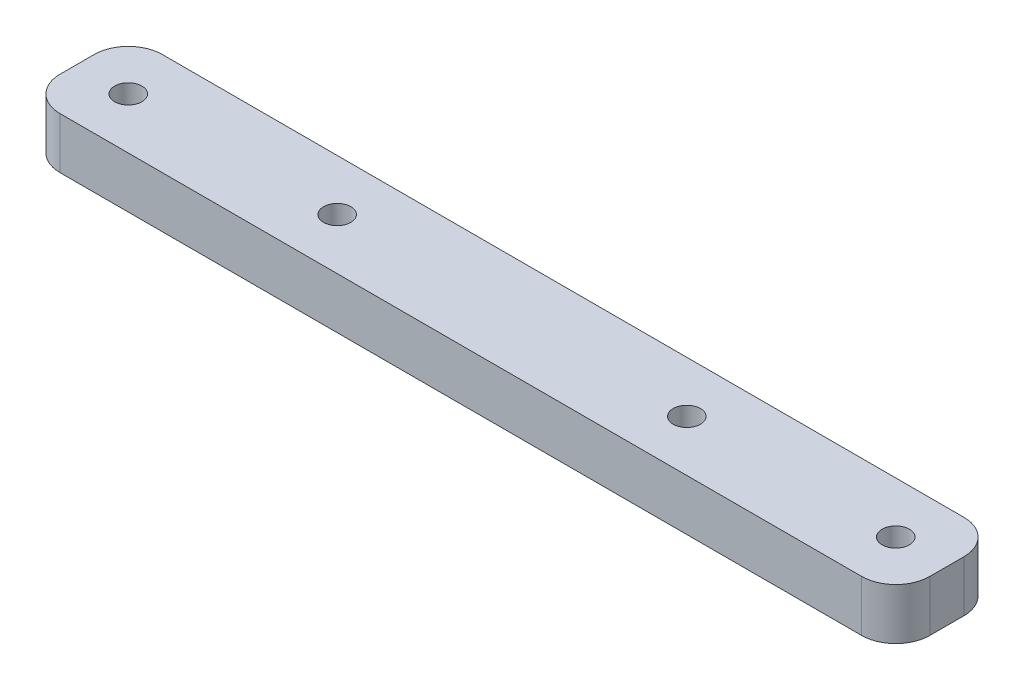
ISO-10303-21;
HEADER;
FILE_DESCRIPTION(('STEP AP214'),'2;1');
FILE_NAME('part.step','',(''),(''),'','','');
FILE_SCHEMA(('AUTOMOTIVE_DESIGN { 1 0 10303 214 1 1 1 1 }'));
ENDSEC;
DATA;
#1=APPLICATION_CONTEXT('core data for automotive mechanical design processes');
#2=APPLICATION_PROTOCOL_DEFINITION('international standard','automotive_design',2000,#1);
#3=PRODUCT_CONTEXT('',#1,'mechanical');
#4=PRODUCT('Part','Part','',(#3));
#5=PRODUCT_RELATED_PRODUCT_CATEGORY('part','',(#4));
#6=PRODUCT_DEFINITION_FORMATION('','',#4);
#7=PRODUCT_DEFINITION_CONTEXT('part definition',#1,'design');
#8=PRODUCT_DEFINITION('design','',#6,#7);
#9=PRODUCT_DEFINITION_SHAPE('','',#8);
#10=(LENGTH_UNIT() NAMED_UNIT(*) SI_UNIT(.MILLI.,.METRE.));
#11=(NAMED_UNIT(*) PLANE_ANGLE_UNIT() SI_UNIT($,.RADIAN.));
#12=(NAMED_UNIT(*) SI_UNIT($,.STERADIAN.) SOLID_ANGLE_UNIT());
#13=UNCERTAINTY_MEASURE_WITH_UNIT(LENGTH_MEASURE(1.E-05),#10,'distance_accuracy_value','');
#14=(GEOMETRIC_REPRESENTATION_CONTEXT(3) GLOBAL_UNCERTAINTY_ASSIGNED_CONTEXT((#13)) GLOBAL_UNIT_ASSIGNED_CONTEXT((#10,
#11,#12)) REPRESENTATION_CONTEXT('',''));
#15=CARTESIAN_POINT('',(0.,0.,0.));
#16=DIRECTION('',(0.,0.,1.));
#17=DIRECTION('',(1.,0.,0.));
#18=AXIS2_PLACEMENT_3D('',#15,#16,#17);
#19=CARTESIAN_POINT('',(51.,3.,0.));
#20=DIRECTION('',(1.,0.,0.));
#21=DIRECTION('',(0.,0.,-1.));
#22=AXIS2_PLACEMENT_3D('',#19,#20,#21);
#23=PLANE('',#22);
#24=DIRECTION('',(0.,0.,1.));
#25=VECTOR('',#24,1.);
#26=CARTESIAN_POINT('',(51.,3.,0.));
#27=LINE('',#26,#25);
#28=CARTESIAN_POINT('',(51.,3.,-2.00000000000001));
#29=VERTEX_POINT('',#28);
#30=CARTESIAN_POINT('',(51.,3.,1.99999999999999));
#31=VERTEX_POINT('',#30);
#32=EDGE_CURVE('E199',#29,#31,#27,.T.);
#33=ORIENTED_EDGE('',*,*,#32,.T.);
#34=DIRECTION('',(0.,-1.,0.));
#35=VECTOR('',#34,1.);
#36=CARTESIAN_POINT('',(51.,-3.,1.99999999999999));
#37=LINE('',#36,#35);
#38=CARTESIAN_POINT('',(51.,-3.,1.99999999999999));
#39=VERTEX_POINT('',#38);
#40=EDGE_CURVE('E180',#31,#39,#37,.T.);
#41=ORIENTED_EDGE('',*,*,#40,.T.);
#42=DIRECTION('',(0.,0.,1.));
#43=VECTOR('',#42,1.);
#44=CARTESIAN_POINT('',(51.,-3.,0.));
#45=LINE('',#44,#43);
#46=CARTESIAN_POINT('',(51.,-3.,-2.00000000000001));
#47=VERTEX_POINT('',#46);
#48=EDGE_CURVE('E143',#47,#39,#45,.T.);
#49=ORIENTED_EDGE('',*,*,#48,.F.);
#50=DIRECTION('',(0.,-1.,0.));
#51=VECTOR('',#50,1.);
#52=CARTESIAN_POINT('',(51.,3.,-2.00000000000001));
#53=LINE('',#52,#51);
#54=EDGE_CURVE('E177',#47,#29,#53,.F.);
#55=ORIENTED_EDGE('',*,*,#54,.T.);
#56=EDGE_LOOP('',(#33,#41,#49,#55));
#57=FACE_BOUND('',#56,.T.);
#58=ADVANCED_FACE('F41',(#57),#23,.T.);
#59=CARTESIAN_POINT('',(0.,3.,-6.));
#60=DIRECTION('',(0.,0.,-1.));
#61=DIRECTION('',(-1.,0.,0.));
#62=AXIS2_PLACEMENT_3D('',#59,#60,#61);
#63=PLANE('',#62);
#64=DIRECTION('',(1.,0.,0.));
#65=VECTOR('',#64,1.);
#66=CARTESIAN_POINT('',(0.,-3.,-6.));
#67=LINE('',#66,#65);
#68=CARTESIAN_POINT('',(-47.,-3.,-6.));
#69=VERTEX_POINT('',#68);
#70=CARTESIAN_POINT('',(47.,-3.,-6.00000000000001));
#71=VERTEX_POINT('',#70);
#72=EDGE_CURVE('E137',#69,#71,#67,.T.);
#73=ORIENTED_EDGE('',*,*,#72,.F.);
#74=DIRECTION('',(0.,-1.,0.));
#75=VECTOR('',#74,1.);
#76=CARTESIAN_POINT('',(-47.,3.,-6.));
#77=LINE('',#76,#75);
#78=CARTESIAN_POINT('',(-47.,3.,-6.));
#79=VERTEX_POINT('',#78);
#80=EDGE_CURVE('E112',#69,#79,#77,.F.);
#81=ORIENTED_EDGE('',*,*,#80,.T.);
#82=DIRECTION('',(1.,0.,0.));
#83=VECTOR('',#82,1.);
#84=CARTESIAN_POINT('',(0.,3.,-6.));
#85=LINE('',#84,#83);
#86=CARTESIAN_POINT('',(47.,3.,-6.00000000000001));
#87=VERTEX_POINT('',#86);
#88=EDGE_CURVE('E202',#79,#87,#85,.T.);
#89=ORIENTED_EDGE('',*,*,#88,.T.);
#90=DIRECTION('',(0.,-1.,0.));
#91=VECTOR('',#90,1.);
#92=CARTESIAN_POINT('',(47.,3.,-6.00000000000001));
#93=LINE('',#92,#91);
#94=EDGE_CURVE('E118',#87,#71,#93,.T.);
#95=ORIENTED_EDGE('',*,*,#94,.T.);
#96=EDGE_LOOP('',(#73,#81,#89,#95));
#97=FACE_BOUND('',#96,.T.);
#98=ADVANCED_FACE('F251',(#97),#63,.T.);
#99=CARTESIAN_POINT('',(-51.,3.,0.));
#100=DIRECTION('',(1.,0.,0.));
#101=DIRECTION('',(0.,0.,-1.));
#102=AXIS2_PLACEMENT_3D('',#99,#100,#101);
#103=PLANE('',#102);
#104=DIRECTION('',(0.,0.,1.));
#105=VECTOR('',#104,1.);
#106=CARTESIAN_POINT('',(-51.,3.,0.));
#107=LINE('',#106,#105);
#108=CARTESIAN_POINT('',(-51.,3.,-2.));
#109=VERTEX_POINT('',#108);
#110=CARTESIAN_POINT('',(-51.,3.,2.));
#111=VERTEX_POINT('',#110);
#112=EDGE_CURVE('E127',#109,#111,#107,.T.);
#113=ORIENTED_EDGE('',*,*,#112,.F.);
#114=DIRECTION('',(0.,-1.,0.));
#115=VECTOR('',#114,1.);
#116=CARTESIAN_POINT('',(-51.,-3.,-2.));
#117=LINE('',#116,#115);
#118=CARTESIAN_POINT('',(-51.,-3.,-2.));
#119=VERTEX_POINT('',#118);
#120=EDGE_CURVE('E111',#109,#119,#117,.T.);
#121=ORIENTED_EDGE('',*,*,#120,.T.);
#122=DIRECTION('',(0.,0.,1.));
#123=VECTOR('',#122,1.);
#124=CARTESIAN_POINT('',(-51.,-3.,0.));
#125=LINE('',#124,#123);
#126=CARTESIAN_POINT('',(-51.,-3.,2.));
#127=VERTEX_POINT('',#126);
#128=EDGE_CURVE('E125',#119,#127,#125,.T.);
#129=ORIENTED_EDGE('',*,*,#128,.T.);
#130=DIRECTION('',(0.,-1.,0.));
#131=VECTOR('',#130,1.);
#132=CARTESIAN_POINT('',(-51.,3.,2.));
#133=LINE('',#132,#131);
#134=EDGE_CURVE('E130',#127,#111,#133,.F.);
#135=ORIENTED_EDGE('',*,*,#134,.T.);
#136=EDGE_LOOP('',(#113,#121,#129,#135));
#137=FACE_BOUND('',#136,.T.);
#138=ADVANCED_FACE('F124',(#137),#103,.F.);
#139=CARTESIAN_POINT('',(0.,3.,6.));
#140=DIRECTION('',(0.,0.,-1.));
#141=DIRECTION('',(-1.,0.,0.));
#142=AXIS2_PLACEMENT_3D('',#139,#140,#141);
#143=PLANE('',#142);
#144=DIRECTION('',(1.,0.,0.));
#145=VECTOR('',#144,1.);
#146=CARTESIAN_POINT('',(0.,-3.,6.));
#147=LINE('',#146,#145);
#148=CARTESIAN_POINT('',(-47.,-3.,6.));
#149=VERTEX_POINT('',#148);
#150=CARTESIAN_POINT('',(47.,-3.,5.99999999999999));
#151=VERTEX_POINT('',#150);
#152=EDGE_CURVE('E136',#149,#151,#147,.T.);
#153=ORIENTED_EDGE('',*,*,#152,.T.);
#154=DIRECTION('',(0.,-1.,0.));
#155=VECTOR('',#154,1.);
#156=CARTESIAN_POINT('',(47.,3.,5.99999999999999));
#157=LINE('',#156,#155);
#158=CARTESIAN_POINT('',(47.,3.,5.99999999999999));
#159=VERTEX_POINT('',#158);
#160=EDGE_CURVE('E11',#151,#159,#157,.F.);
#161=ORIENTED_EDGE('',*,*,#160,.T.);
#162=DIRECTION('',(1.,0.,0.));
#163=VECTOR('',#162,1.);
#164=CARTESIAN_POINT('',(0.,3.,6.));
#165=LINE('',#164,#163);
#166=CARTESIAN_POINT('',(-47.,3.,6.));
#167=VERTEX_POINT('',#166);
#168=EDGE_CURVE('E187',#167,#159,#165,.T.);
#169=ORIENTED_EDGE('',*,*,#168,.F.);
#170=DIRECTION('',(0.,-1.,0.));
#171=VECTOR('',#170,1.);
#172=CARTESIAN_POINT('',(-47.,3.,6.));
#173=LINE('',#172,#171);
#174=EDGE_CURVE('E50',#167,#149,#173,.T.);
#175=ORIENTED_EDGE('',*,*,#174,.T.);
#176=EDGE_LOOP('',(#153,#161,#169,#175));
#177=FACE_BOUND('',#176,.T.);
#178=ADVANCED_FACE('F186',(#177),#143,.F.);
#179=CARTESIAN_POINT('',(-45.,3.,0.));
#180=DIRECTION('',(0.,-1.,0.));
#181=DIRECTION('',(0.,0.,-1.));
#182=AXIS2_PLACEMENT_3D('',#179,#180,#181);
#183=CYLINDRICAL_SURFACE('',#182,1.60000000000001);
#184=CARTESIAN_POINT('',(-45.,3.,0.));
#185=DIRECTION('',(0.,1.,0.));
#186=DIRECTION('',(0.,0.,1.));
#187=AXIS2_PLACEMENT_3D('',#184,#185,#186);
#188=CIRCLE('',#187,1.60000000000001);
#189=CARTESIAN_POINT('',(-45.,3.,1.60000000000001));
#190=VERTEX_POINT('',#189);
#191=EDGE_CURVE('E203',#190,#190,#188,.T.);
#192=ORIENTED_EDGE('',*,*,#191,.T.);
#193=EDGE_LOOP('',(#192));
#194=FACE_BOUND('',#193,.T.);
#195=CARTESIAN_POINT('',(-45.,-3.,0.));
#196=DIRECTION('',(0.,1.,0.));
#197=DIRECTION('',(0.,0.,1.));
#198=AXIS2_PLACEMENT_3D('',#195,#196,#197);
#199=CIRCLE('',#198,1.60000000000001);
#200=CARTESIAN_POINT('',(-45.,-3.,1.60000000000001));
#201=VERTEX_POINT('',#200);
#202=EDGE_CURVE('E229',#201,#201,#199,.T.);
#203=ORIENTED_EDGE('',*,*,#202,.F.);
#204=EDGE_LOOP('',(#203));
#205=FACE_BOUND('',#204,.T.);
#206=ADVANCED_FACE('F236',(#194,#205),#183,.F.);
#207=CARTESIAN_POINT('',(-20.5,3.,0.));
#208=DIRECTION('',(0.,-1.,0.));
#209=DIRECTION('',(0.,0.,-1.));
#210=AXIS2_PLACEMENT_3D('',#207,#208,#209);
#211=CYLINDRICAL_SURFACE('',#210,1.6);
#212=CARTESIAN_POINT('',(-20.5,3.,0.));
#213=DIRECTION('',(0.,1.,0.));
#214=DIRECTION('',(0.,0.,1.));
#215=AXIS2_PLACEMENT_3D('',#212,#213,#214);
#216=CIRCLE('',#215,1.6);
#217=CARTESIAN_POINT('',(-20.5,3.,1.6));
#218=VERTEX_POINT('',#217);
#219=EDGE_CURVE('E210',#218,#218,#216,.T.);
#220=ORIENTED_EDGE('',*,*,#219,.T.);
#221=EDGE_LOOP('',(#220));
#222=FACE_BOUND('',#221,.T.);
#223=CARTESIAN_POINT('',(-20.5,-3.,0.));
#224=DIRECTION('',(0.,1.,0.));
#225=DIRECTION('',(0.,0.,1.));
#226=AXIS2_PLACEMENT_3D('',#223,#224,#225);
#227=CIRCLE('',#226,1.6);
#228=CARTESIAN_POINT('',(-20.5,-3.,1.6));
#229=VERTEX_POINT('',#228);
#230=EDGE_CURVE('E225',#229,#229,#227,.T.);
#231=ORIENTED_EDGE('',*,*,#230,.F.);
#232=EDGE_LOOP('',(#231));
#233=FACE_BOUND('',#232,.T.);
#234=ADVANCED_FACE('F238',(#222,#233),#211,.F.);
#235=CARTESIAN_POINT('',(20.5,3.,0.));
#236=DIRECTION('',(0.,-1.,0.));
#237=DIRECTION('',(0.,0.,-1.));
#238=AXIS2_PLACEMENT_3D('',#235,#236,#237);
#239=CYLINDRICAL_SURFACE('',#238,1.6);
#240=CARTESIAN_POINT('',(20.5,3.,0.));
#241=DIRECTION('',(0.,1.,0.));
#242=DIRECTION('',(0.,0.,1.));
#243=AXIS2_PLACEMENT_3D('',#240,#241,#242);
#244=CIRCLE('',#243,1.6);
#245=CARTESIAN_POINT('',(20.5,3.,1.6));
#246=VERTEX_POINT('',#245);
#247=EDGE_CURVE('E150',#246,#246,#244,.F.);
#248=ORIENTED_EDGE('',*,*,#247,.F.);
#249=EDGE_LOOP('',(#248));
#250=FACE_BOUND('',#249,.T.);
#251=CARTESIAN_POINT('',(20.5,-3.,0.));
#252=DIRECTION('',(0.,1.,0.));
#253=DIRECTION('',(0.,0.,1.));
#254=AXIS2_PLACEMENT_3D('',#251,#252,#253);
#255=CIRCLE('',#254,1.6);
#256=CARTESIAN_POINT('',(20.5,-3.,1.6));
#257=VERTEX_POINT('',#256);
#258=EDGE_CURVE('E221',#257,#257,#255,.F.);
#259=ORIENTED_EDGE('',*,*,#258,.T.);
#260=EDGE_LOOP('',(#259));
#261=FACE_BOUND('',#260,.T.);
#262=ADVANCED_FACE('F245',(#250,#261),#239,.F.);
#263=CARTESIAN_POINT('',(45.,3.,0.));
#264=DIRECTION('',(0.,-1.,0.));
#265=DIRECTION('',(0.,0.,-1.));
#266=AXIS2_PLACEMENT_3D('',#263,#264,#265);
#267=CYLINDRICAL_SURFACE('',#266,1.60000000000001);
#268=CARTESIAN_POINT('',(45.,3.,0.));
#269=DIRECTION('',(0.,1.,0.));
#270=DIRECTION('',(0.,0.,1.));
#271=AXIS2_PLACEMENT_3D('',#268,#269,#270);
#272=CIRCLE('',#271,1.60000000000001);
#273=CARTESIAN_POINT('',(45.,3.,1.6));
#274=VERTEX_POINT('',#273);
#275=EDGE_CURVE('E152',#274,#274,#272,.F.);
#276=ORIENTED_EDGE('',*,*,#275,.F.);
#277=EDGE_LOOP('',(#276));
#278=FACE_BOUND('',#277,.T.);
#279=CARTESIAN_POINT('',(45.,-3.,0.));
#280=DIRECTION('',(0.,1.,0.));
#281=DIRECTION('',(0.,0.,1.));
#282=AXIS2_PLACEMENT_3D('',#279,#280,#281);
#283=CIRCLE('',#282,1.60000000000001);
#284=CARTESIAN_POINT('',(45.,-3.,1.6));
#285=VERTEX_POINT('',#284);
#286=EDGE_CURVE('E141',#285,#285,#283,.F.);
#287=ORIENTED_EDGE('',*,*,#286,.T.);
#288=EDGE_LOOP('',(#287));
#289=FACE_BOUND('',#288,.T.);
#290=ADVANCED_FACE('F260',(#278,#289),#267,.F.);
#291=CARTESIAN_POINT('',(0.,3.,0.));
#292=DIRECTION('',(0.,1.,0.));
#293=DIRECTION('',(0.,0.,1.));
#294=AXIS2_PLACEMENT_3D('',#291,#292,#293);
#295=PLANE('',#294);
#296=ORIENTED_EDGE('',*,*,#247,.T.);
#297=EDGE_LOOP('',(#296));
#298=FACE_BOUND('',#297,.T.);
#299=ORIENTED_EDGE('',*,*,#219,.F.);
#300=EDGE_LOOP('',(#299));
#301=FACE_BOUND('',#300,.T.);
#302=ORIENTED_EDGE('',*,*,#191,.F.);
#303=EDGE_LOOP('',(#302));
#304=FACE_BOUND('',#303,.T.);
#305=ORIENTED_EDGE('',*,*,#88,.F.);
#306=CARTESIAN_POINT('',(-47.,3.,-2.));
#307=DIRECTION('',(0.,1.,0.));
#308=DIRECTION('',(0.,0.,1.));
#309=AXIS2_PLACEMENT_3D('',#306,#307,#308);
#310=CIRCLE('',#309,4.);
#311=EDGE_CURVE('E174',#79,#109,#310,.T.);
#312=ORIENTED_EDGE('',*,*,#311,.T.);
#313=ORIENTED_EDGE('',*,*,#112,.T.);
#314=CARTESIAN_POINT('',(-47.,3.,2.));
#315=DIRECTION('',(0.,1.,0.));
#316=DIRECTION('',(0.,0.,1.));
#317=AXIS2_PLACEMENT_3D('',#314,#315,#316);
#318=CIRCLE('',#317,4.);
#319=EDGE_CURVE('E62',#111,#167,#318,.T.);
#320=ORIENTED_EDGE('',*,*,#319,.T.);
#321=ORIENTED_EDGE('',*,*,#168,.T.);
#322=CARTESIAN_POINT('',(47.,3.,1.99999999999999));
#323=DIRECTION('',(0.,1.,0.));
#324=DIRECTION('',(0.,0.,1.));
#325=AXIS2_PLACEMENT_3D('',#322,#323,#324);
#326=CIRCLE('',#325,4.);
#327=EDGE_CURVE('E171',#159,#31,#326,.T.);
#328=ORIENTED_EDGE('',*,*,#327,.T.);
#329=ORIENTED_EDGE('',*,*,#32,.F.);
#330=CARTESIAN_POINT('',(47.,3.,-2.00000000000001));
#331=DIRECTION('',(0.,1.,0.));
#332=DIRECTION('',(0.,0.,1.));
#333=AXIS2_PLACEMENT_3D('',#330,#331,#332);
#334=CIRCLE('',#333,4.);
#335=EDGE_CURVE('E168',#29,#87,#334,.T.);
#336=ORIENTED_EDGE('',*,*,#335,.T.);
#337=EDGE_LOOP('',(#305,#312,#313,#320,#321,#328,#329,#336));
#338=FACE_BOUND('',#337,.T.);
#339=ORIENTED_EDGE('',*,*,#275,.T.);
#340=EDGE_LOOP('',(#339));
#341=FACE_BOUND('',#340,.T.);
#342=ADVANCED_FACE('F263',(#298,#301,#304,#338,#341),#295,.T.);
#343=CARTESIAN_POINT('',(0.,-3.,0.));
#344=DIRECTION('',(0.,1.,0.));
#345=DIRECTION('',(0.,0.,1.));
#346=AXIS2_PLACEMENT_3D('',#343,#344,#345);
#347=PLANE('',#346);
#348=ORIENTED_EDGE('',*,*,#258,.F.);
#349=EDGE_LOOP('',(#348));
#350=FACE_BOUND('',#349,.T.);
#351=ORIENTED_EDGE('',*,*,#230,.T.);
#352=EDGE_LOOP('',(#351));
#353=FACE_BOUND('',#352,.T.);
#354=ORIENTED_EDGE('',*,*,#202,.T.);
#355=EDGE_LOOP('',(#354));
#356=FACE_BOUND('',#355,.T.);
#357=ORIENTED_EDGE('',*,*,#128,.F.);
#358=CARTESIAN_POINT('',(-47.,-3.,-2.));
#359=DIRECTION('',(0.,1.,0.));
#360=DIRECTION('',(0.,0.,1.));
#361=AXIS2_PLACEMENT_3D('',#358,#359,#360);
#362=CIRCLE('',#361,4.);
#363=EDGE_CURVE('E107',#119,#69,#362,.F.);
#364=ORIENTED_EDGE('',*,*,#363,.T.);
#365=ORIENTED_EDGE('',*,*,#72,.T.);
#366=CARTESIAN_POINT('',(47.,-3.,-2.00000000000001));
#367=DIRECTION('',(0.,1.,0.));
#368=DIRECTION('',(0.,0.,1.));
#369=AXIS2_PLACEMENT_3D('',#366,#367,#368);
#370=CIRCLE('',#369,4.);
#371=EDGE_CURVE('E156',#71,#47,#370,.F.);
#372=ORIENTED_EDGE('',*,*,#371,.T.);
#373=ORIENTED_EDGE('',*,*,#48,.T.);
#374=CARTESIAN_POINT('',(47.,-3.,1.99999999999999));
#375=DIRECTION('',(0.,1.,0.));
#376=DIRECTION('',(0.,0.,1.));
#377=AXIS2_PLACEMENT_3D('',#374,#375,#376);
#378=CIRCLE('',#377,4.);
#379=EDGE_CURVE('E119',#39,#151,#378,.F.);
#380=ORIENTED_EDGE('',*,*,#379,.T.);
#381=ORIENTED_EDGE('',*,*,#152,.F.);
#382=CARTESIAN_POINT('',(-47.,-3.,2.));
#383=DIRECTION('',(0.,1.,0.));
#384=DIRECTION('',(0.,0.,1.));
#385=AXIS2_PLACEMENT_3D('',#382,#383,#384);
#386=CIRCLE('',#385,4.);
#387=EDGE_CURVE('E129',#149,#127,#386,.F.);
#388=ORIENTED_EDGE('',*,*,#387,.T.);
#389=EDGE_LOOP('',(#357,#364,#365,#372,#373,#380,#381,#388));
#390=FACE_BOUND('',#389,.T.);
#391=ORIENTED_EDGE('',*,*,#286,.F.);
#392=EDGE_LOOP('',(#391));
#393=FACE_BOUND('',#392,.T.);
#394=ADVANCED_FACE('F132',(#350,#353,#356,#390,#393),#347,.F.);
#395=CARTESIAN_POINT('',(-47.,3.,-2.));
#396=DIRECTION('',(0.,1.,0.));
#397=DIRECTION('',(0.,0.,1.));
#398=AXIS2_PLACEMENT_3D('',#395,#396,#397);
#399=CYLINDRICAL_SURFACE('',#398,4.);
#400=ORIENTED_EDGE('',*,*,#311,.F.);
#401=ORIENTED_EDGE('',*,*,#80,.F.);
#402=ORIENTED_EDGE('',*,*,#363,.F.);
#403=ORIENTED_EDGE('',*,*,#120,.F.);
#404=EDGE_LOOP('',(#400,#401,#402,#403));
#405=FACE_BOUND('',#404,.T.);
#406=ADVANCED_FACE('F110',(#405),#399,.T.);
#407=CARTESIAN_POINT('',(47.,3.,1.99999999999999));
#408=DIRECTION('',(0.,1.,0.));
#409=DIRECTION('',(0.,0.,1.));
#410=AXIS2_PLACEMENT_3D('',#407,#408,#409);
#411=CYLINDRICAL_SURFACE('',#410,4.);
#412=ORIENTED_EDGE('',*,*,#327,.F.);
#413=ORIENTED_EDGE('',*,*,#160,.F.);
#414=ORIENTED_EDGE('',*,*,#379,.F.);
#415=ORIENTED_EDGE('',*,*,#40,.F.);
#416=EDGE_LOOP('',(#412,#413,#414,#415));
#417=FACE_BOUND('',#416,.T.);
#418=ADVANCED_FACE('F194',(#417),#411,.T.);
#419=CARTESIAN_POINT('',(47.,3.,-2.00000000000001));
#420=DIRECTION('',(0.,-1.,0.));
#421=DIRECTION('',(0.,0.,-1.));
#422=AXIS2_PLACEMENT_3D('',#419,#420,#421);
#423=CYLINDRICAL_SURFACE('',#422,4.);
#424=ORIENTED_EDGE('',*,*,#335,.F.);
#425=ORIENTED_EDGE('',*,*,#54,.F.);
#426=ORIENTED_EDGE('',*,*,#371,.F.);
#427=ORIENTED_EDGE('',*,*,#94,.F.);
#428=EDGE_LOOP('',(#424,#425,#426,#427));
#429=FACE_BOUND('',#428,.T.);
#430=ADVANCED_FACE('F286',(#429),#423,.T.);
#431=CARTESIAN_POINT('',(-47.,3.,2.));
#432=DIRECTION('',(0.,-1.,0.));
#433=DIRECTION('',(0.,0.,-1.));
#434=AXIS2_PLACEMENT_3D('',#431,#432,#433);
#435=CYLINDRICAL_SURFACE('',#434,4.);
#436=ORIENTED_EDGE('',*,*,#319,.F.);
#437=ORIENTED_EDGE('',*,*,#134,.F.);
#438=ORIENTED_EDGE('',*,*,#387,.F.);
#439=ORIENTED_EDGE('',*,*,#174,.F.);
#440=EDGE_LOOP('',(#436,#437,#438,#439));
#441=FACE_BOUND('',#440,.T.);
#442=ADVANCED_FACE('F43',(#441),#435,.T.);
#443=CLOSED_SHELL('',(#58,#98,#138,#178,#206,#234,#262,#290,#342,#394,#406,#418,#430,#442));
#444=MANIFOLD_SOLID_BREP('B2',#443);
#445=ADVANCED_BREP_SHAPE_REPRESENTATION('',(#18,#444),#14);
#446=SHAPE_DEFINITION_REPRESENTATION(#9,#445);
ENDSEC;
END-ISO-10303-21;
